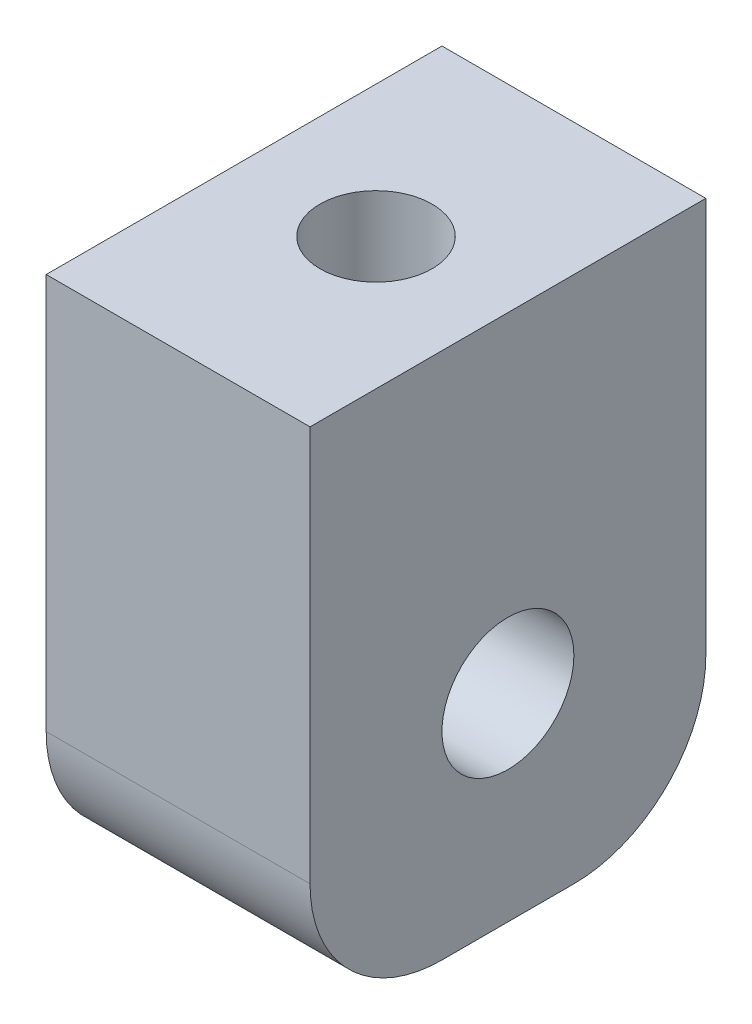
ISO-10303-21;
HEADER;
FILE_DESCRIPTION(('STEP AP214'),'2;1');
FILE_NAME('part.step','',(''),(''),'','','');
FILE_SCHEMA(('AUTOMOTIVE_DESIGN { 1 0 10303 214 1 1 1 1 }'));
ENDSEC;
DATA;
#1=APPLICATION_CONTEXT('core data for automotive mechanical design processes');
#2=APPLICATION_PROTOCOL_DEFINITION('international standard','automotive_design',2000,#1);
#3=PRODUCT_CONTEXT('',#1,'mechanical');
#4=PRODUCT('Part','Part','',(#3));
#5=PRODUCT_RELATED_PRODUCT_CATEGORY('part','',(#4));
#6=PRODUCT_DEFINITION_FORMATION('','',#4);
#7=PRODUCT_DEFINITION_CONTEXT('part definition',#1,'design');
#8=PRODUCT_DEFINITION('design','',#6,#7);
#9=PRODUCT_DEFINITION_SHAPE('','',#8);
#10=(LENGTH_UNIT() NAMED_UNIT(*) SI_UNIT(.MILLI.,.METRE.));
#11=(NAMED_UNIT(*) PLANE_ANGLE_UNIT() SI_UNIT($,.RADIAN.));
#12=(NAMED_UNIT(*) SI_UNIT($,.STERADIAN.) SOLID_ANGLE_UNIT());
#13=UNCERTAINTY_MEASURE_WITH_UNIT(LENGTH_MEASURE(1.E-05),#10,'distance_accuracy_value','');
#14=(GEOMETRIC_REPRESENTATION_CONTEXT(3) GLOBAL_UNCERTAINTY_ASSIGNED_CONTEXT((#13)) GLOBAL_UNIT_ASSIGNED_CONTEXT((#10,
#11,#12)) REPRESENTATION_CONTEXT('',''));
#15=CARTESIAN_POINT('',(0.,0.,0.));
#16=DIRECTION('',(0.,0.,1.));
#17=DIRECTION('',(1.,0.,0.));
#18=AXIS2_PLACEMENT_3D('',#15,#16,#17);
#19=CARTESIAN_POINT('',(10.,-40.,-15.));
#20=DIRECTION('',(1.,0.,0.));
#21=DIRECTION('',(0.,0.,-1.));
#22=AXIS2_PLACEMENT_3D('',#19,#20,#21);
#23=PLANE('',#22);
#24=CARTESIAN_POINT('',(10.,-25.,0.));
#25=DIRECTION('',(1.,0.,0.));
#26=DIRECTION('',(0.,0.,-1.));
#27=AXIS2_PLACEMENT_3D('',#24,#25,#26);
#28=CIRCLE('',#27,5.);
#29=CARTESIAN_POINT('',(10.,-25.,-5.00000000000001));
#30=VERTEX_POINT('',#29);
#31=EDGE_CURVE('E195',#30,#30,#28,.T.);
#32=ORIENTED_EDGE('',*,*,#31,.F.);
#33=EDGE_LOOP('',(#32));
#34=FACE_BOUND('',#33,.T.);
#35=DIRECTION('',(0.,0.,-1.));
#36=VECTOR('',#35,1.);
#37=CARTESIAN_POINT('',(10.,-40.,-15.));
#38=LINE('',#37,#36);
#39=CARTESIAN_POINT('',(10.,-40.,5.));
#40=VERTEX_POINT('',#39);
#41=CARTESIAN_POINT('',(10.,-40.,-5.));
#42=VERTEX_POINT('',#41);
#43=EDGE_CURVE('E123',#40,#42,#38,.T.);
#44=ORIENTED_EDGE('',*,*,#43,.T.);
#45=CARTESIAN_POINT('',(10.,-30.,-5.));
#46=DIRECTION('',(1.,0.,0.));
#47=DIRECTION('',(0.,0.,-1.));
#48=AXIS2_PLACEMENT_3D('',#45,#46,#47);
#49=CIRCLE('',#48,10.);
#50=CARTESIAN_POINT('',(10.,-30.,-15.));
#51=VERTEX_POINT('',#50);
#52=EDGE_CURVE('E41',#42,#51,#49,.T.);
#53=ORIENTED_EDGE('',*,*,#52,.T.);
#54=DIRECTION('',(0.,1.,0.));
#55=VECTOR('',#54,1.);
#56=CARTESIAN_POINT('',(10.,-40.,-15.));
#57=LINE('',#56,#55);
#58=CARTESIAN_POINT('',(10.,0.,-15.));
#59=VERTEX_POINT('',#58);
#60=EDGE_CURVE('E88',#51,#59,#57,.T.);
#61=ORIENTED_EDGE('',*,*,#60,.T.);
#62=DIRECTION('',(0.,0.,-1.));
#63=VECTOR('',#62,1.);
#64=CARTESIAN_POINT('',(10.,0.,-15.));
#65=LINE('',#64,#63);
#66=CARTESIAN_POINT('',(10.,0.,15.));
#67=VERTEX_POINT('',#66);
#68=EDGE_CURVE('E92',#67,#59,#65,.T.);
#69=ORIENTED_EDGE('',*,*,#68,.F.);
#70=DIRECTION('',(0.,1.,0.));
#71=VECTOR('',#70,1.);
#72=CARTESIAN_POINT('',(10.,-40.,15.));
#73=LINE('',#72,#71);
#74=CARTESIAN_POINT('',(10.,-30.,15.));
#75=VERTEX_POINT('',#74);
#76=EDGE_CURVE('E124',#75,#67,#73,.T.);
#77=ORIENTED_EDGE('',*,*,#76,.F.);
#78=CARTESIAN_POINT('',(10.,-30.,5.));
#79=DIRECTION('',(1.,0.,0.));
#80=DIRECTION('',(0.,0.,-1.));
#81=AXIS2_PLACEMENT_3D('',#78,#79,#80);
#82=CIRCLE('',#81,10.);
#83=EDGE_CURVE('E48',#75,#40,#82,.T.);
#84=ORIENTED_EDGE('',*,*,#83,.T.);
#85=EDGE_LOOP('',(#44,#53,#61,#69,#77,#84));
#86=FACE_BOUND('',#85,.T.);
#87=ADVANCED_FACE('F33',(#34,#86),#23,.T.);
#88=CARTESIAN_POINT('',(-10.,-40.,15.));
#89=DIRECTION('',(0.,0.,1.));
#90=DIRECTION('',(1.,0.,0.));
#91=AXIS2_PLACEMENT_3D('',#88,#89,#90);
#92=PLANE('',#91);
#93=DIRECTION('',(0.,1.,0.));
#94=VECTOR('',#93,1.);
#95=CARTESIAN_POINT('',(-10.,-40.,15.));
#96=LINE('',#95,#94);
#97=CARTESIAN_POINT('',(-10.,-30.,15.));
#98=VERTEX_POINT('',#97);
#99=CARTESIAN_POINT('',(-10.,0.,15.));
#100=VERTEX_POINT('',#99);
#101=EDGE_CURVE('E127',#98,#100,#96,.T.);
#102=ORIENTED_EDGE('',*,*,#101,.F.);
#103=DIRECTION('',(1.,0.,0.));
#104=VECTOR('',#103,1.);
#105=CARTESIAN_POINT('',(10.,-30.,15.));
#106=LINE('',#105,#104);
#107=EDGE_CURVE('E11',#98,#75,#106,.T.);
#108=ORIENTED_EDGE('',*,*,#107,.T.);
#109=ORIENTED_EDGE('',*,*,#76,.T.);
#110=DIRECTION('',(1.,0.,0.));
#111=VECTOR('',#110,1.);
#112=CARTESIAN_POINT('',(-10.,0.,15.));
#113=LINE('',#112,#111);
#114=EDGE_CURVE('E112',#100,#67,#113,.T.);
#115=ORIENTED_EDGE('',*,*,#114,.F.);
#116=EDGE_LOOP('',(#102,#108,#109,#115));
#117=FACE_BOUND('',#116,.T.);
#118=ADVANCED_FACE('F145',(#117),#92,.T.);
#119=CARTESIAN_POINT('',(-10.,-40.,-15.));
#120=DIRECTION('',(-1.,0.,0.));
#121=DIRECTION('',(0.,0.,1.));
#122=AXIS2_PLACEMENT_3D('',#119,#120,#121);
#123=PLANE('',#122);
#124=CARTESIAN_POINT('',(-10.,-25.,0.));
#125=DIRECTION('',(1.,0.,0.));
#126=DIRECTION('',(0.,0.,-1.));
#127=AXIS2_PLACEMENT_3D('',#124,#125,#126);
#128=CIRCLE('',#127,5.);
#129=CARTESIAN_POINT('',(-10.,-25.,-5.00000000000001));
#130=VERTEX_POINT('',#129);
#131=EDGE_CURVE('E192',#130,#130,#128,.T.);
#132=ORIENTED_EDGE('',*,*,#131,.T.);
#133=EDGE_LOOP('',(#132));
#134=FACE_BOUND('',#133,.T.);
#135=DIRECTION('',(0.,1.,0.));
#136=VECTOR('',#135,1.);
#137=CARTESIAN_POINT('',(-10.,-40.,-15.));
#138=LINE('',#137,#136);
#139=CARTESIAN_POINT('',(-10.,-30.,-15.));
#140=VERTEX_POINT('',#139);
#141=CARTESIAN_POINT('',(-10.,0.,-15.));
#142=VERTEX_POINT('',#141);
#143=EDGE_CURVE('E98',#140,#142,#138,.T.);
#144=ORIENTED_EDGE('',*,*,#143,.F.);
#145=CARTESIAN_POINT('',(-10.,-30.,-5.));
#146=DIRECTION('',(-1.,0.,0.));
#147=DIRECTION('',(0.,0.,1.));
#148=AXIS2_PLACEMENT_3D('',#145,#146,#147);
#149=CIRCLE('',#148,10.);
#150=CARTESIAN_POINT('',(-10.,-40.,-5.));
#151=VERTEX_POINT('',#150);
#152=EDGE_CURVE('E133',#140,#151,#149,.T.);
#153=ORIENTED_EDGE('',*,*,#152,.T.);
#154=DIRECTION('',(0.,0.,1.));
#155=VECTOR('',#154,1.);
#156=CARTESIAN_POINT('',(-10.,-40.,-15.));
#157=LINE('',#156,#155);
#158=CARTESIAN_POINT('',(-10.,-40.,5.));
#159=VERTEX_POINT('',#158);
#160=EDGE_CURVE('E99',#151,#159,#157,.T.);
#161=ORIENTED_EDGE('',*,*,#160,.T.);
#162=CARTESIAN_POINT('',(-10.,-30.,5.));
#163=DIRECTION('',(-1.,0.,0.));
#164=DIRECTION('',(0.,0.,1.));
#165=AXIS2_PLACEMENT_3D('',#162,#163,#164);
#166=CIRCLE('',#165,10.);
#167=EDGE_CURVE('E131',#159,#98,#166,.T.);
#168=ORIENTED_EDGE('',*,*,#167,.T.);
#169=ORIENTED_EDGE('',*,*,#101,.T.);
#170=DIRECTION('',(0.,0.,1.));
#171=VECTOR('',#170,1.);
#172=CARTESIAN_POINT('',(-10.,0.,-15.));
#173=LINE('',#172,#171);
#174=EDGE_CURVE('E108',#142,#100,#173,.T.);
#175=ORIENTED_EDGE('',*,*,#174,.F.);
#176=EDGE_LOOP('',(#144,#153,#161,#168,#169,#175));
#177=FACE_BOUND('',#176,.T.);
#178=ADVANCED_FACE('F143',(#134,#177),#123,.T.);
#179=CARTESIAN_POINT('',(-10.,-40.,-15.));
#180=DIRECTION('',(0.,0.,-1.));
#181=DIRECTION('',(-1.,0.,0.));
#182=AXIS2_PLACEMENT_3D('',#179,#180,#181);
#183=PLANE('',#182);
#184=ORIENTED_EDGE('',*,*,#60,.F.);
#185=DIRECTION('',(-1.,0.,0.));
#186=VECTOR('',#185,1.);
#187=CARTESIAN_POINT('',(-10.,-30.,-15.));
#188=LINE('',#187,#186);
#189=EDGE_CURVE('E126',#51,#140,#188,.T.);
#190=ORIENTED_EDGE('',*,*,#189,.T.);
#191=ORIENTED_EDGE('',*,*,#143,.T.);
#192=DIRECTION('',(-1.,0.,0.));
#193=VECTOR('',#192,1.);
#194=CARTESIAN_POINT('',(-10.,0.,-15.));
#195=LINE('',#194,#193);
#196=EDGE_CURVE('E102',#59,#142,#195,.T.);
#197=ORIENTED_EDGE('',*,*,#196,.F.);
#198=EDGE_LOOP('',(#184,#190,#191,#197));
#199=FACE_BOUND('',#198,.T.);
#200=ADVANCED_FACE('F103',(#199),#183,.T.);
#201=CARTESIAN_POINT('',(0.,-40.,0.));
#202=DIRECTION('',(0.,1.,0.));
#203=DIRECTION('',(0.,0.,1.));
#204=AXIS2_PLACEMENT_3D('',#201,#202,#203);
#205=PLANE('',#204);
#206=ORIENTED_EDGE('',*,*,#160,.F.);
#207=DIRECTION('',(-1.,0.,0.));
#208=VECTOR('',#207,1.);
#209=CARTESIAN_POINT('',(10.,-40.,-5.));
#210=LINE('',#209,#208);
#211=EDGE_CURVE('E55',#151,#42,#210,.F.);
#212=ORIENTED_EDGE('',*,*,#211,.T.);
#213=ORIENTED_EDGE('',*,*,#43,.F.);
#214=DIRECTION('',(1.,0.,0.));
#215=VECTOR('',#214,1.);
#216=CARTESIAN_POINT('',(-10.,-40.,5.));
#217=LINE('',#216,#215);
#218=EDGE_CURVE('E135',#40,#159,#217,.F.);
#219=ORIENTED_EDGE('',*,*,#218,.T.);
#220=EDGE_LOOP('',(#206,#212,#213,#219));
#221=FACE_BOUND('',#220,.T.);
#222=ADVANCED_FACE('F138',(#221),#205,.F.);
#223=CARTESIAN_POINT('',(0.,0.,0.));
#224=DIRECTION('',(0.,1.,0.));
#225=DIRECTION('',(0.,0.,1.));
#226=AXIS2_PLACEMENT_3D('',#223,#224,#225);
#227=PLANE('',#226);
#228=CARTESIAN_POINT('',(0.,0.,0.));
#229=DIRECTION('',(0.,1.,0.));
#230=DIRECTION('',(0.,0.,1.));
#231=AXIS2_PLACEMENT_3D('',#228,#229,#230);
#232=CIRCLE('',#231,4.25);
#233=CARTESIAN_POINT('',(0.,0.,4.25));
#234=VERTEX_POINT('',#233);
#235=EDGE_CURVE('E116',#234,#234,#232,.T.);
#236=ORIENTED_EDGE('',*,*,#235,.F.);
#237=EDGE_LOOP('',(#236));
#238=FACE_BOUND('',#237,.T.);
#239=ORIENTED_EDGE('',*,*,#68,.T.);
#240=ORIENTED_EDGE('',*,*,#196,.T.);
#241=ORIENTED_EDGE('',*,*,#174,.T.);
#242=ORIENTED_EDGE('',*,*,#114,.T.);
#243=EDGE_LOOP('',(#239,#240,#241,#242));
#244=FACE_BOUND('',#243,.T.);
#245=ADVANCED_FACE('F110',(#238,#244),#227,.T.);
#246=CARTESIAN_POINT('',(0.,-15.,0.));
#247=DIRECTION('',(0.,1.,0.));
#248=DIRECTION('',(0.,0.,1.));
#249=AXIS2_PLACEMENT_3D('',#246,#247,#248);
#250=CYLINDRICAL_SURFACE('',#249,4.25);
#251=CARTESIAN_POINT('',(0.,-15.,0.));
#252=DIRECTION('',(0.,1.,0.));
#253=DIRECTION('',(0.,0.,1.));
#254=AXIS2_PLACEMENT_3D('',#251,#252,#253);
#255=CIRCLE('',#254,4.25);
#256=CARTESIAN_POINT('',(0.,-15.,4.25));
#257=VERTEX_POINT('',#256);
#258=EDGE_CURVE('E113',#257,#257,#255,.T.);
#259=ORIENTED_EDGE('',*,*,#258,.F.);
#260=EDGE_LOOP('',(#259));
#261=FACE_BOUND('',#260,.T.);
#262=ORIENTED_EDGE('',*,*,#235,.T.);
#263=EDGE_LOOP('',(#262));
#264=FACE_BOUND('',#263,.T.);
#265=ADVANCED_FACE('F174',(#261,#264),#250,.F.);
#266=CARTESIAN_POINT('',(0.,-15.,0.));
#267=DIRECTION('',(0.,1.,0.));
#268=DIRECTION('',(0.,0.,1.));
#269=AXIS2_PLACEMENT_3D('',#266,#267,#268);
#270=PLANE('',#269);
#271=ORIENTED_EDGE('',*,*,#258,.T.);
#272=EDGE_LOOP('',(#271));
#273=FACE_BOUND('',#272,.T.);
#274=ADVANCED_FACE('F168',(#273),#270,.T.);
#275=CARTESIAN_POINT('',(-10.,-25.,0.));
#276=DIRECTION('',(1.,0.,0.));
#277=DIRECTION('',(0.,0.,-1.));
#278=AXIS2_PLACEMENT_3D('',#275,#276,#277);
#279=CYLINDRICAL_SURFACE('',#278,5.);
#280=CARTESIAN_POINT('',(-10.,-25.,-5.00000000000001));
#281=CARTESIAN_POINT('',(-9.79166666666667,-25.,-5.00000000000001));
#282=CARTESIAN_POINT('',(-9.58333333333334,-25.,-5.00000000000001));
#283=CARTESIAN_POINT('',(-9.16666666666667,-25.,-5.00000000000001));
#284=CARTESIAN_POINT('',(-8.95833333333334,-25.,-5.00000000000001));
#285=CARTESIAN_POINT('',(-8.54166666666667,-25.,-5.00000000000001));
#286=CARTESIAN_POINT('',(-8.33333333333334,-25.,-5.00000000000001));
#287=CARTESIAN_POINT('',(-7.91666666666667,-25.,-5.00000000000001));
#288=CARTESIAN_POINT('',(-7.70833333333334,-25.,-5.00000000000001));
#289=CARTESIAN_POINT('',(-7.29166666666667,-25.,-5.00000000000001));
#290=CARTESIAN_POINT('',(-7.08333333333334,-25.,-5.00000000000001));
#291=CARTESIAN_POINT('',(-6.66666666666667,-25.,-5.00000000000001));
#292=CARTESIAN_POINT('',(-6.45833333333334,-25.,-5.00000000000001));
#293=CARTESIAN_POINT('',(-6.04166666666667,-25.,-5.00000000000001));
#294=CARTESIAN_POINT('',(-5.83333333333334,-25.,-5.00000000000001));
#295=CARTESIAN_POINT('',(-5.41666666666667,-25.,-5.00000000000001));
#296=CARTESIAN_POINT('',(-5.20833333333334,-25.,-5.00000000000001));
#297=CARTESIAN_POINT('',(-4.79166666666667,-25.,-5.00000000000001));
#298=CARTESIAN_POINT('',(-4.58333333333334,-25.,-5.00000000000001));
#299=CARTESIAN_POINT('',(-4.16666666666667,-25.,-5.00000000000001));
#300=CARTESIAN_POINT('',(-3.95833333333334,-25.,-5.00000000000001));
#301=CARTESIAN_POINT('',(-3.54166666666667,-25.,-5.00000000000001));
#302=CARTESIAN_POINT('',(-3.33333333333334,-25.,-5.00000000000001));
#303=CARTESIAN_POINT('',(-2.91666666666667,-25.,-5.00000000000001));
#304=CARTESIAN_POINT('',(-2.70833333333334,-25.,-5.00000000000001));
#305=CARTESIAN_POINT('',(-2.29166666666667,-25.,-5.00000000000001));
#306=CARTESIAN_POINT('',(-2.08333333333334,-25.,-5.00000000000001));
#307=CARTESIAN_POINT('',(-1.66666666666667,-25.,-5.00000000000001));
#308=CARTESIAN_POINT('',(-1.45833333333334,-25.,-5.00000000000001));
#309=CARTESIAN_POINT('',(-1.04166666666667,-25.,-5.00000000000001));
#310=CARTESIAN_POINT('',(-0.833333333333337,-25.,-5.00000000000001));
#311=CARTESIAN_POINT('',(-0.416666666666671,-25.,-5.00000000000001));
#312=CARTESIAN_POINT('',(-0.208333333333337,-25.,-5.00000000000001));
#313=CARTESIAN_POINT('',(0.20833333333333,-25.,-5.00000000000001));
#314=CARTESIAN_POINT('',(0.416666666666664,-25.,-5.00000000000001));
#315=CARTESIAN_POINT('',(0.833333333333331,-25.,-5.00000000000001));
#316=CARTESIAN_POINT('',(1.04166666666666,-25.,-5.00000000000001));
#317=CARTESIAN_POINT('',(1.45833333333333,-25.,-5.00000000000001));
#318=CARTESIAN_POINT('',(1.66666666666666,-25.,-5.00000000000001));
#319=CARTESIAN_POINT('',(2.08333333333333,-25.,-5.00000000000001));
#320=CARTESIAN_POINT('',(2.29166666666666,-25.,-5.00000000000001));
#321=CARTESIAN_POINT('',(2.70833333333333,-25.,-5.00000000000001));
#322=CARTESIAN_POINT('',(2.91666666666666,-25.,-5.00000000000001));
#323=CARTESIAN_POINT('',(3.33333333333333,-25.,-5.00000000000001));
#324=CARTESIAN_POINT('',(3.54166666666666,-25.,-5.00000000000001));
#325=CARTESIAN_POINT('',(3.95833333333333,-25.,-5.00000000000001));
#326=CARTESIAN_POINT('',(4.16666666666666,-25.,-5.00000000000001));
#327=CARTESIAN_POINT('',(4.58333333333333,-25.,-5.00000000000001));
#328=CARTESIAN_POINT('',(4.79166666666666,-25.,-5.00000000000001));
#329=CARTESIAN_POINT('',(5.20833333333333,-25.,-5.00000000000001));
#330=CARTESIAN_POINT('',(5.41666666666666,-25.,-5.00000000000001));
#331=CARTESIAN_POINT('',(5.83333333333333,-25.,-5.00000000000001));
#332=CARTESIAN_POINT('',(6.04166666666666,-25.,-5.00000000000001));
#333=CARTESIAN_POINT('',(6.45833333333333,-25.,-5.00000000000001));
#334=CARTESIAN_POINT('',(6.66666666666666,-25.,-5.00000000000001));
#335=CARTESIAN_POINT('',(7.08333333333333,-25.,-5.00000000000001));
#336=CARTESIAN_POINT('',(7.29166666666666,-25.,-5.00000000000001));
#337=CARTESIAN_POINT('',(7.70833333333333,-25.,-5.00000000000001));
#338=CARTESIAN_POINT('',(7.91666666666666,-25.,-5.00000000000001));
#339=CARTESIAN_POINT('',(8.33333333333333,-25.,-5.00000000000001));
#340=CARTESIAN_POINT('',(8.54166666666666,-25.,-5.00000000000001));
#341=CARTESIAN_POINT('',(8.95833333333333,-25.,-5.00000000000001));
#342=CARTESIAN_POINT('',(9.16666666666666,-25.,-5.00000000000001));
#343=CARTESIAN_POINT('',(9.58333333333333,-25.,-5.00000000000001));
#344=CARTESIAN_POINT('',(9.79166666666666,-25.,-5.00000000000001));
#345=CARTESIAN_POINT('',(10.,-25.,-5.00000000000001));
#346=B_SPLINE_CURVE_WITH_KNOTS('',3,(#280,#281,#282,#283,#284,#285,#286,#287,#288,#289,#290,
#291,#292,#293,#294,#295,#296,#297,#298,#299,#300,#301,#302,#303,#304,#305,#306,#307,#308,#309,
#310,#311,#312,#313,#314,#315,#316,#317,#318,#319,#320,#321,#322,#323,#324,#325,#326,#327,#328,
#329,#330,#331,#332,#333,#334,#335,#336,#337,#338,#339,#340,#341,#342,#343,#344,#345),
.UNSPECIFIED.,.F.,.F.,(4,2,2,2,2,2,2,2,2,2,2,2,2,2,2,2,2,2,2,2,2,2,2,2,2,2,2,2,2,2,2,2,4),(0.,
0.624999999999999,1.25,1.875,2.5,3.125,3.75,4.375,5.,5.625,6.25,6.875,7.5,8.125,8.75,9.375,10.,
10.625,11.25,11.875,12.5,13.125,13.75,14.375,15.,15.625,16.25,16.875,17.5,18.125,18.75,19.375,
20.),.UNSPECIFIED.);
#347=EDGE_CURVE('BSEAM162',#130,#30,#346,.T.);
#348=ORIENTED_EDGE('',*,*,#131,.F.);
#349=ORIENTED_EDGE('',*,*,#31,.T.);
#350=ORIENTED_EDGE('',*,*,#347,.T.);
#351=ORIENTED_EDGE('',*,*,#347,.F.);
#352=EDGE_LOOP('',(#348,#350,#349,#351));
#353=FACE_BOUND('',#352,.T.);
#354=ADVANCED_FACE('F162',(#353),#279,.F.);
#355=CARTESIAN_POINT('',(-10.,-30.,-5.));
#356=DIRECTION('',(1.,0.,0.));
#357=DIRECTION('',(0.,0.,-1.));
#358=AXIS2_PLACEMENT_3D('',#355,#356,#357);
#359=CYLINDRICAL_SURFACE('',#358,10.);
#360=ORIENTED_EDGE('',*,*,#52,.F.);
#361=ORIENTED_EDGE('',*,*,#211,.F.);
#362=ORIENTED_EDGE('',*,*,#152,.F.);
#363=ORIENTED_EDGE('',*,*,#189,.F.);
#364=EDGE_LOOP('',(#360,#361,#362,#363));
#365=FACE_BOUND('',#364,.T.);
#366=ADVANCED_FACE('F160',(#365),#359,.T.);
#367=CARTESIAN_POINT('',(-10.,-30.,5.));
#368=DIRECTION('',(-1.,0.,0.));
#369=DIRECTION('',(0.,0.,1.));
#370=AXIS2_PLACEMENT_3D('',#367,#368,#369);
#371=CYLINDRICAL_SURFACE('',#370,10.);
#372=ORIENTED_EDGE('',*,*,#167,.F.);
#373=ORIENTED_EDGE('',*,*,#218,.F.);
#374=ORIENTED_EDGE('',*,*,#83,.F.);
#375=ORIENTED_EDGE('',*,*,#107,.F.);
#376=EDGE_LOOP('',(#372,#373,#374,#375));
#377=FACE_BOUND('',#376,.T.);
#378=ADVANCED_FACE('F35',(#377),#371,.T.);
#379=CLOSED_SHELL('',(#87,#118,#178,#200,#222,#245,#265,#274,#354,#366,#378));
#380=MANIFOLD_SOLID_BREP('B2',#379);
#381=ADVANCED_BREP_SHAPE_REPRESENTATION('',(#18,#380),#14);
#382=SHAPE_DEFINITION_REPRESENTATION(#9,#381);
ENDSEC;
END-ISO-10303-21;
